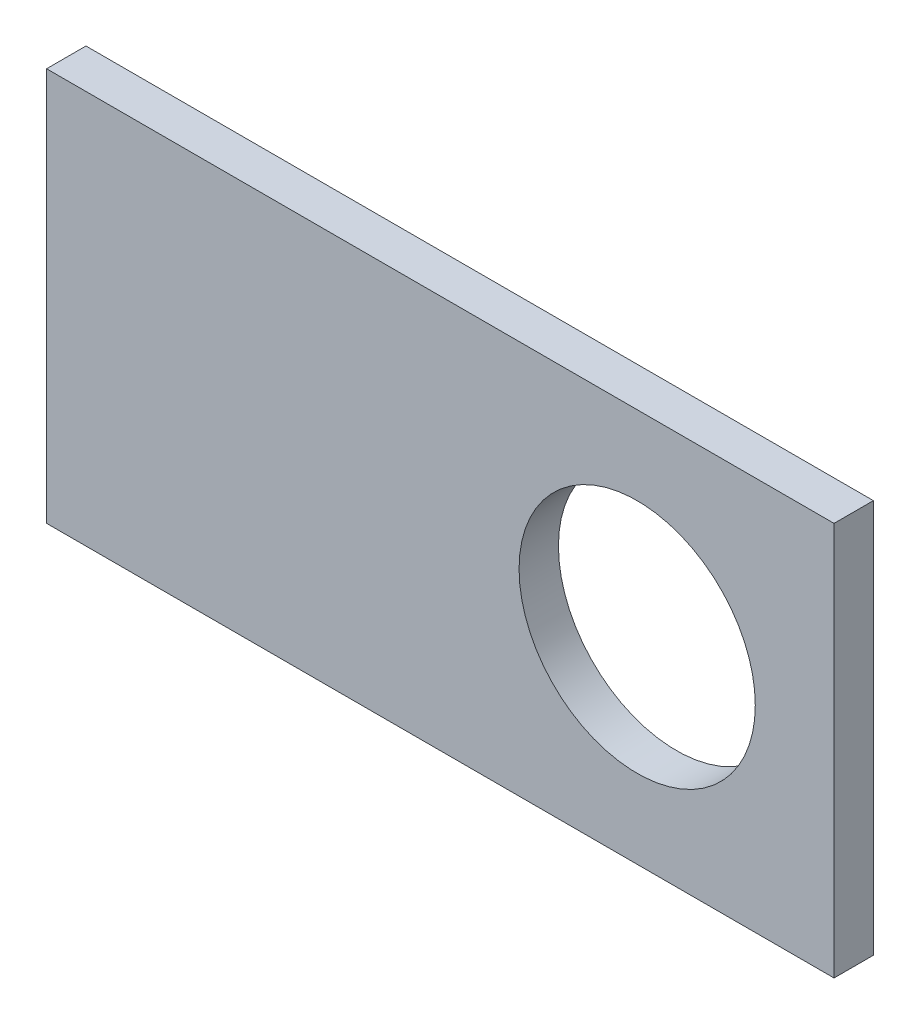
ISO-10303-21;
HEADER;
FILE_DESCRIPTION(('STEP AP214'),'2;1');
FILE_NAME('part.step','',(''),(''),'','','');
FILE_SCHEMA(('AUTOMOTIVE_DESIGN { 1 0 10303 214 1 1 1 1 }'));
ENDSEC;
DATA;
#1=APPLICATION_CONTEXT('core data for automotive mechanical design processes');
#2=APPLICATION_PROTOCOL_DEFINITION('international standard','automotive_design',2000,#1);
#3=PRODUCT_CONTEXT('',#1,'mechanical');
#4=PRODUCT('Part','Part','',(#3));
#5=PRODUCT_RELATED_PRODUCT_CATEGORY('part','',(#4));
#6=PRODUCT_DEFINITION_FORMATION('','',#4);
#7=PRODUCT_DEFINITION_CONTEXT('part definition',#1,'design');
#8=PRODUCT_DEFINITION('design','',#6,#7);
#9=PRODUCT_DEFINITION_SHAPE('','',#8);
#10=(LENGTH_UNIT() NAMED_UNIT(*) SI_UNIT(.MILLI.,.METRE.));
#11=(NAMED_UNIT(*) PLANE_ANGLE_UNIT() SI_UNIT($,.RADIAN.));
#12=(NAMED_UNIT(*) SI_UNIT($,.STERADIAN.) SOLID_ANGLE_UNIT());
#13=UNCERTAINTY_MEASURE_WITH_UNIT(LENGTH_MEASURE(1.E-05),#10,'distance_accuracy_value','');
#14=(GEOMETRIC_REPRESENTATION_CONTEXT(3) GLOBAL_UNCERTAINTY_ASSIGNED_CONTEXT((#13)) GLOBAL_UNIT_ASSIGNED_CONTEXT((#10,
#11,#12)) REPRESENTATION_CONTEXT('',''));
#15=CARTESIAN_POINT('',(0.,0.,0.));
#16=DIRECTION('',(0.,0.,1.));
#17=DIRECTION('',(1.,0.,0.));
#18=AXIS2_PLACEMENT_3D('',#15,#16,#17);
#19=CARTESIAN_POINT('',(0.,0.,500.));
#20=DIRECTION('',(0.,0.,-1.));
#21=DIRECTION('',(-1.,0.,0.));
#22=AXIS2_PLACEMENT_3D('',#19,#20,#21);
#23=PLANE('',#22);
#24=DIRECTION('',(0.,-1.,0.));
#25=VECTOR('',#24,1.);
#26=CARTESIAN_POINT('',(0.,0.,500.));
#27=LINE('',#26,#25);
#28=CARTESIAN_POINT('',(0.,5000.,500.));
#29=VERTEX_POINT('',#28);
#30=CARTESIAN_POINT('',(0.,0.,500.));
#31=VERTEX_POINT('',#30);
#32=EDGE_CURVE('E90',#29,#31,#27,.T.);
#33=ORIENTED_EDGE('',*,*,#32,.T.);
#34=DIRECTION('',(1.,0.,0.));
#35=VECTOR('',#34,1.);
#36=CARTESIAN_POINT('',(0.,0.,500.));
#37=LINE('',#36,#35);
#38=CARTESIAN_POINT('',(10000.,0.,500.));
#39=VERTEX_POINT('',#38);
#40=EDGE_CURVE('E85',#31,#39,#37,.T.);
#41=ORIENTED_EDGE('',*,*,#40,.T.);
#42=DIRECTION('',(0.,1.,0.));
#43=VECTOR('',#42,1.);
#44=CARTESIAN_POINT('',(10000.,0.,500.));
#45=LINE('',#44,#43);
#46=CARTESIAN_POINT('',(10000.,5000.,500.));
#47=VERTEX_POINT('',#46);
#48=EDGE_CURVE('E88',#39,#47,#45,.T.);
#49=ORIENTED_EDGE('',*,*,#48,.T.);
#50=DIRECTION('',(-1.,0.,0.));
#51=VECTOR('',#50,1.);
#52=CARTESIAN_POINT('',(0.,5000.,500.));
#53=LINE('',#52,#51);
#54=EDGE_CURVE('E55',#47,#29,#53,.T.);
#55=ORIENTED_EDGE('',*,*,#54,.T.);
#56=EDGE_LOOP('',(#33,#41,#49,#55));
#57=FACE_BOUND('',#56,.T.);
#58=CARTESIAN_POINT('',(7500.,2500.,500.));
#59=DIRECTION('',(0.,0.,1.));
#60=DIRECTION('',(1.,0.,0.));
#61=AXIS2_PLACEMENT_3D('',#58,#59,#60);
#62=CIRCLE('',#61,1500.);
#63=CARTESIAN_POINT('',(9000.,2500.,500.));
#64=VERTEX_POINT('',#63);
#65=EDGE_CURVE('E105',#64,#64,#62,.T.);
#66=ORIENTED_EDGE('',*,*,#65,.F.);
#67=EDGE_LOOP('',(#66));
#68=FACE_BOUND('',#67,.T.);
#69=ADVANCED_FACE('F38',(#57,#68),#23,.F.);
#70=CARTESIAN_POINT('',(0.,0.,0.));
#71=DIRECTION('',(0.,0.,-1.));
#72=DIRECTION('',(-1.,0.,0.));
#73=AXIS2_PLACEMENT_3D('',#70,#71,#72);
#74=PLANE('',#73);
#75=DIRECTION('',(0.,-1.,0.));
#76=VECTOR('',#75,1.);
#77=CARTESIAN_POINT('',(0.,0.,0.));
#78=LINE('',#77,#76);
#79=CARTESIAN_POINT('',(0.,5000.,0.));
#80=VERTEX_POINT('',#79);
#81=CARTESIAN_POINT('',(0.,0.,0.));
#82=VERTEX_POINT('',#81);
#83=EDGE_CURVE('E102',#80,#82,#78,.T.);
#84=ORIENTED_EDGE('',*,*,#83,.F.);
#85=DIRECTION('',(-1.,0.,0.));
#86=VECTOR('',#85,1.);
#87=CARTESIAN_POINT('',(0.,5000.,0.));
#88=LINE('',#87,#86);
#89=CARTESIAN_POINT('',(10000.,5000.,0.));
#90=VERTEX_POINT('',#89);
#91=EDGE_CURVE('E78',#90,#80,#88,.T.);
#92=ORIENTED_EDGE('',*,*,#91,.F.);
#93=DIRECTION('',(0.,1.,0.));
#94=VECTOR('',#93,1.);
#95=CARTESIAN_POINT('',(10000.,0.,0.));
#96=LINE('',#95,#94);
#97=CARTESIAN_POINT('',(10000.,0.,0.));
#98=VERTEX_POINT('',#97);
#99=EDGE_CURVE('E72',#98,#90,#96,.T.);
#100=ORIENTED_EDGE('',*,*,#99,.F.);
#101=DIRECTION('',(1.,0.,0.));
#102=VECTOR('',#101,1.);
#103=CARTESIAN_POINT('',(0.,0.,0.));
#104=LINE('',#103,#102);
#105=EDGE_CURVE('E94',#82,#98,#104,.T.);
#106=ORIENTED_EDGE('',*,*,#105,.F.);
#107=EDGE_LOOP('',(#84,#92,#100,#106));
#108=FACE_BOUND('',#107,.T.);
#109=CARTESIAN_POINT('',(7500.,2500.,0.));
#110=DIRECTION('',(0.,0.,1.));
#111=DIRECTION('',(1.,0.,0.));
#112=AXIS2_PLACEMENT_3D('',#109,#110,#111);
#113=CIRCLE('',#112,1500.);
#114=CARTESIAN_POINT('',(9000.,2500.,0.));
#115=VERTEX_POINT('',#114);
#116=EDGE_CURVE('E117',#115,#115,#113,.T.);
#117=ORIENTED_EDGE('',*,*,#116,.T.);
#118=EDGE_LOOP('',(#117));
#119=FACE_BOUND('',#118,.T.);
#120=ADVANCED_FACE('F113',(#108,#119),#74,.T.);
#121=CARTESIAN_POINT('',(0.,0.,500.));
#122=DIRECTION('',(1.,0.,0.));
#123=DIRECTION('',(0.,0.,-1.));
#124=AXIS2_PLACEMENT_3D('',#121,#122,#123);
#125=PLANE('',#124);
#126=ORIENTED_EDGE('',*,*,#83,.T.);
#127=DIRECTION('',(0.,0.,-1.));
#128=VECTOR('',#127,1.);
#129=CARTESIAN_POINT('',(0.,0.,500.));
#130=LINE('',#129,#128);
#131=EDGE_CURVE('E11',#31,#82,#130,.T.);
#132=ORIENTED_EDGE('',*,*,#131,.F.);
#133=ORIENTED_EDGE('',*,*,#32,.F.);
#134=DIRECTION('',(0.,0.,-1.));
#135=VECTOR('',#134,1.);
#136=CARTESIAN_POINT('',(0.,5000.,500.));
#137=LINE('',#136,#135);
#138=EDGE_CURVE('E98',#29,#80,#137,.T.);
#139=ORIENTED_EDGE('',*,*,#138,.T.);
#140=EDGE_LOOP('',(#126,#132,#133,#139));
#141=FACE_BOUND('',#140,.T.);
#142=ADVANCED_FACE('F40',(#141),#125,.F.);
#143=CARTESIAN_POINT('',(0.,0.,500.));
#144=DIRECTION('',(0.,1.,0.));
#145=DIRECTION('',(0.,0.,1.));
#146=AXIS2_PLACEMENT_3D('',#143,#144,#145);
#147=PLANE('',#146);
#148=ORIENTED_EDGE('',*,*,#105,.T.);
#149=DIRECTION('',(0.,0.,-1.));
#150=VECTOR('',#149,1.);
#151=CARTESIAN_POINT('',(10000.,0.,500.));
#152=LINE('',#151,#150);
#153=EDGE_CURVE('E47',#39,#98,#152,.T.);
#154=ORIENTED_EDGE('',*,*,#153,.F.);
#155=ORIENTED_EDGE('',*,*,#40,.F.);
#156=ORIENTED_EDGE('',*,*,#131,.T.);
#157=EDGE_LOOP('',(#148,#154,#155,#156));
#158=FACE_BOUND('',#157,.T.);
#159=ADVANCED_FACE('F93',(#158),#147,.F.);
#160=CARTESIAN_POINT('',(10000.,0.,500.));
#161=DIRECTION('',(-1.,0.,0.));
#162=DIRECTION('',(0.,0.,1.));
#163=AXIS2_PLACEMENT_3D('',#160,#161,#162);
#164=PLANE('',#163);
#165=ORIENTED_EDGE('',*,*,#99,.T.);
#166=DIRECTION('',(0.,0.,-1.));
#167=VECTOR('',#166,1.);
#168=CARTESIAN_POINT('',(10000.,5000.,500.));
#169=LINE('',#168,#167);
#170=EDGE_CURVE('E95',#47,#90,#169,.T.);
#171=ORIENTED_EDGE('',*,*,#170,.F.);
#172=ORIENTED_EDGE('',*,*,#48,.F.);
#173=ORIENTED_EDGE('',*,*,#153,.T.);
#174=EDGE_LOOP('',(#165,#171,#172,#173));
#175=FACE_BOUND('',#174,.T.);
#176=ADVANCED_FACE('F96',(#175),#164,.F.);
#177=CARTESIAN_POINT('',(0.,5000.,500.));
#178=DIRECTION('',(0.,-1.,0.));
#179=DIRECTION('',(0.,0.,-1.));
#180=AXIS2_PLACEMENT_3D('',#177,#178,#179);
#181=PLANE('',#180);
#182=ORIENTED_EDGE('',*,*,#91,.T.);
#183=ORIENTED_EDGE('',*,*,#138,.F.);
#184=ORIENTED_EDGE('',*,*,#54,.F.);
#185=ORIENTED_EDGE('',*,*,#170,.T.);
#186=EDGE_LOOP('',(#182,#183,#184,#185));
#187=FACE_BOUND('',#186,.T.);
#188=ADVANCED_FACE('F110',(#187),#181,.F.);
#189=CARTESIAN_POINT('',(7500.,2500.,500.));
#190=DIRECTION('',(0.,0.,-1.));
#191=DIRECTION('',(-1.,0.,0.));
#192=AXIS2_PLACEMENT_3D('',#189,#190,#191);
#193=CYLINDRICAL_SURFACE('',#192,1500.);
#194=ORIENTED_EDGE('',*,*,#65,.T.);
#195=EDGE_LOOP('',(#194));
#196=FACE_BOUND('',#195,.T.);
#197=ORIENTED_EDGE('',*,*,#116,.F.);
#198=EDGE_LOOP('',(#197));
#199=FACE_BOUND('',#198,.T.);
#200=ADVANCED_FACE('F123',(#196,#199),#193,.F.);
#201=CLOSED_SHELL('',(#69,#120,#142,#159,#176,#188,#200));
#202=MANIFOLD_SOLID_BREP('B2',#201);
#203=ADVANCED_BREP_SHAPE_REPRESENTATION('',(#18,#202),#14);
#204=SHAPE_DEFINITION_REPRESENTATION(#9,#203);
ENDSEC;
END-ISO-10303-21;
